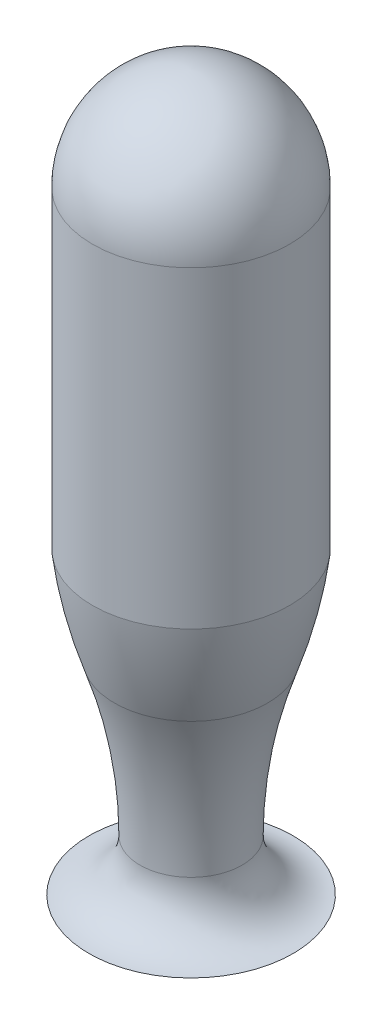
ISO-10303-21;
HEADER;
FILE_DESCRIPTION(('STEP AP214'),'2;1');
FILE_NAME('part.step','',(''),(''),'','','');
FILE_SCHEMA(('AUTOMOTIVE_DESIGN { 1 0 10303 214 1 1 1 1 }'));
ENDSEC;
DATA;
#1=APPLICATION_CONTEXT('core data for automotive mechanical design processes');
#2=APPLICATION_PROTOCOL_DEFINITION('international standard','automotive_design',2000,#1);
#3=PRODUCT_CONTEXT('',#1,'mechanical');
#4=PRODUCT('Part','Part','',(#3));
#5=PRODUCT_RELATED_PRODUCT_CATEGORY('part','',(#4));
#6=PRODUCT_DEFINITION_FORMATION('','',#4);
#7=PRODUCT_DEFINITION_CONTEXT('part definition',#1,'design');
#8=PRODUCT_DEFINITION('design','',#6,#7);
#9=PRODUCT_DEFINITION_SHAPE('','',#8);
#10=(LENGTH_UNIT() NAMED_UNIT(*) SI_UNIT(.MILLI.,.METRE.));
#11=(NAMED_UNIT(*) PLANE_ANGLE_UNIT() SI_UNIT($,.RADIAN.));
#12=(NAMED_UNIT(*) SI_UNIT($,.STERADIAN.) SOLID_ANGLE_UNIT());
#13=UNCERTAINTY_MEASURE_WITH_UNIT(LENGTH_MEASURE(1.E-05),#10,'distance_accuracy_value','');
#14=(GEOMETRIC_REPRESENTATION_CONTEXT(3) GLOBAL_UNCERTAINTY_ASSIGNED_CONTEXT((#13)) GLOBAL_UNIT_ASSIGNED_CONTEXT((#10,
#11,#12)) REPRESENTATION_CONTEXT('',''));
#15=CARTESIAN_POINT('',(0.,0.,0.));
#16=DIRECTION('',(0.,0.,1.));
#17=DIRECTION('',(1.,0.,0.));
#18=AXIS2_PLACEMENT_3D('',#15,#16,#17);
#19=CARTESIAN_POINT('',(0.,-5.81079378493446,0.));
#20=DIRECTION('',(0.,-1.,0.));
#21=DIRECTION('',(0.,0.,-1.));
#22=AXIS2_PLACEMENT_3D('',#19,#20,#21);
#23=PLANE('',#22);
#24=CARTESIAN_POINT('',(0.,-5.81079378493446,0.));
#25=DIRECTION('',(0.,-1.,0.));
#26=DIRECTION('',(0.,0.,-1.));
#27=AXIS2_PLACEMENT_3D('',#24,#25,#26);
#28=CIRCLE('',#27,1.5);
#29=CARTESIAN_POINT('',(0.,-5.81079378493446,-1.5));
#30=VERTEX_POINT('',#29);
#31=EDGE_CURVE('E66',#30,#30,#28,.T.);
#32=ORIENTED_EDGE('',*,*,#31,.F.);
#33=EDGE_LOOP('',(#32));
#34=FACE_BOUND('',#33,.T.);
#35=CARTESIAN_POINT('',(0.,-5.81079378493446,0.));
#36=DIRECTION('',(0.,-1.,0.));
#37=DIRECTION('',(0.,0.,-1.));
#38=AXIS2_PLACEMENT_3D('',#35,#36,#37);
#39=CIRCLE('',#38,4.);
#40=CARTESIAN_POINT('',(0.,-5.81079378493446,-4.));
#41=VERTEX_POINT('',#40);
#42=EDGE_CURVE('E62',#41,#41,#39,.T.);
#43=ORIENTED_EDGE('',*,*,#42,.T.);
#44=EDGE_LOOP('',(#43));
#45=FACE_BOUND('',#44,.T.);
#46=ADVANCED_FACE('F33',(#34,#45),#23,.T.);
#47=CARTESIAN_POINT('',(0.,18.1892062150655,0.138290187286729));
#48=DIRECTION('',(-1.,0.,0.));
#49=DIRECTION('',(0.,0.,-1.));
#50=AXIS2_PLACEMENT_3D('',#47,#48,#49);
#51=CIRCLE('',#50,4.);
#52=TRIMMED_CURVE('',#51,(PARAMETER_VALUE(-1.5362168890634)),(PARAMETER_VALUE(1.5362168890634)),
.T.,.PARAMETER.);
#53=CARTESIAN_POINT('',(0.,18.1892062150655,0.));
#54=DIRECTION('',(0.,-1.,0.));
#55=AXIS1_PLACEMENT('',#53,#54);
#56=SURFACE_OF_REVOLUTION('',#52,#55);
#57=CARTESIAN_POINT('',(0.,22.1868149783264,0.));
#58=VERTEX_POINT('',#57);
#59=VERTEX_LOOP('',#58);
#60=FACE_BOUND('',#59,.T.);
#61=CARTESIAN_POINT('',(0.,18.1892062150655,0.));
#62=DIRECTION('',(0.,-1.,0.));
#63=DIRECTION('',(0.,0.,-1.));
#64=AXIS2_PLACEMENT_3D('',#61,#62,#63);
#65=CIRCLE('',#64,3.86170981271327);
#66=CARTESIAN_POINT('',(0.,18.1892062150655,-3.86170981271327));
#67=VERTEX_POINT('',#66);
#68=EDGE_CURVE('E11',#67,#67,#65,.T.);
#69=ORIENTED_EDGE('',*,*,#68,.F.);
#70=EDGE_LOOP('',(#69));
#71=FACE_BOUND('',#70,.T.);
#72=ADVANCED_FACE('F42',(#60,#71),#56,.T.);
#73=CARTESIAN_POINT('',(0.,-5.81079378493446,0.));
#74=DIRECTION('',(0.,-1.,0.));
#75=DIRECTION('',(0.,0.,-1.));
#76=AXIS2_PLACEMENT_3D('',#73,#74,#75);
#77=CYLINDRICAL_SURFACE('',#76,3.86170981271327);
#78=ORIENTED_EDGE('',*,*,#68,.T.);
#79=EDGE_LOOP('',(#78));
#80=FACE_BOUND('',#79,.T.);
#81=CARTESIAN_POINT('',(0.,5.93141686401696,0.));
#82=DIRECTION('',(0.,-1.,0.));
#83=DIRECTION('',(0.,0.,-1.));
#84=AXIS2_PLACEMENT_3D('',#81,#82,#83);
#85=CIRCLE('',#84,3.86170981271327);
#86=CARTESIAN_POINT('',(0.,5.93141686401696,-3.86170981271327));
#87=VERTEX_POINT('',#86);
#88=EDGE_CURVE('E39',#87,#87,#85,.T.);
#89=ORIENTED_EDGE('',*,*,#88,.F.);
#90=EDGE_LOOP('',(#89));
#91=FACE_BOUND('',#90,.T.);
#92=ADVANCED_FACE('F45',(#80,#91),#77,.T.);
#93=CARTESIAN_POINT('',(0.,8.18920621506554,0.));
#94=DIRECTION('',(0.,-1.,0.));
#95=DIRECTION('',(0.,0.,-1.));
#96=AXIS2_PLACEMENT_3D('',#93,#94,#95);
#97=DEGENERATE_TOROIDAL_SURFACE('',#96,14.5,18.5,.F.);
#98=ORIENTED_EDGE('',*,*,#88,.T.);
#99=EDGE_LOOP('',(#98));
#100=FACE_BOUND('',#99,.T.);
#101=CARTESIAN_POINT('',(0.,2.18920621506554,0.));
#102=DIRECTION('',(0.,-1.,0.));
#103=DIRECTION('',(0.,0.,-1.));
#104=AXIS2_PLACEMENT_3D('',#101,#102,#103);
#105=CIRCLE('',#104,2.99999999999998);
#106=CARTESIAN_POINT('',(0.,2.18920621506554,-2.99999999999998));
#107=VERTEX_POINT('',#106);
#108=EDGE_CURVE('E55',#107,#107,#105,.T.);
#109=ORIENTED_EDGE('',*,*,#108,.F.);
#110=EDGE_LOOP('',(#109));
#111=FACE_BOUND('',#110,.T.);
#112=ADVANCED_FACE('F50',(#100,#111),#97,.F.);
#113=CARTESIAN_POINT('',(0.,-3.81079378493446,0.));
#114=DIRECTION('',(0.,-1.,0.));
#115=DIRECTION('',(0.,0.,-1.));
#116=AXIS2_PLACEMENT_3D('',#113,#114,#115);
#117=TOROIDAL_SURFACE('',#116,20.5,18.5);
#118=ORIENTED_EDGE('',*,*,#108,.T.);
#119=EDGE_LOOP('',(#118));
#120=FACE_BOUND('',#119,.T.);
#121=CARTESIAN_POINT('',(0.,-3.81079378493446,0.));
#122=DIRECTION('',(0.,-1.,0.));
#123=DIRECTION('',(0.,0.,-1.));
#124=AXIS2_PLACEMENT_3D('',#121,#122,#123);
#125=CIRCLE('',#124,1.99999999999999);
#126=CARTESIAN_POINT('',(0.,-3.81079378493446,-1.99999999999999));
#127=VERTEX_POINT('',#126);
#128=EDGE_CURVE('E57',#127,#127,#125,.T.);
#129=ORIENTED_EDGE('',*,*,#128,.F.);
#130=EDGE_LOOP('',(#129));
#131=FACE_BOUND('',#130,.T.);
#132=ADVANCED_FACE('F86',(#120,#131),#117,.F.);
#133=CARTESIAN_POINT('',(0.,-3.81079378493446,0.));
#134=DIRECTION('',(0.,-1.,0.));
#135=DIRECTION('',(0.,0.,-1.));
#136=AXIS2_PLACEMENT_3D('',#133,#134,#135);
#137=TOROIDAL_SURFACE('',#136,4.,2.);
#138=ORIENTED_EDGE('',*,*,#128,.T.);
#139=EDGE_LOOP('',(#138));
#140=FACE_BOUND('',#139,.T.);
#141=ORIENTED_EDGE('',*,*,#42,.F.);
#142=EDGE_LOOP('',(#141));
#143=FACE_BOUND('',#142,.T.);
#144=ADVANCED_FACE('F77',(#140,#143),#137,.F.);
#145=CARTESIAN_POINT('',(0.,4.18920621506554,0.));
#146=DIRECTION('',(0.,-1.,0.));
#147=DIRECTION('',(0.,0.,-1.));
#148=AXIS2_PLACEMENT_3D('',#145,#146,#147);
#149=CYLINDRICAL_SURFACE('',#148,1.5);
#150=CARTESIAN_POINT('',(0.,4.18920621506554,0.));
#151=DIRECTION('',(0.,-1.,0.));
#152=DIRECTION('',(0.,0.,-1.));
#153=AXIS2_PLACEMENT_3D('',#150,#151,#152);
#154=CIRCLE('',#153,1.5);
#155=CARTESIAN_POINT('',(0.,4.18920621506554,-1.5));
#156=VERTEX_POINT('',#155);
#157=EDGE_CURVE('E65',#156,#156,#154,.T.);
#158=ORIENTED_EDGE('',*,*,#157,.F.);
#159=EDGE_LOOP('',(#158));
#160=FACE_BOUND('',#159,.T.);
#161=ORIENTED_EDGE('',*,*,#31,.T.);
#162=EDGE_LOOP('',(#161));
#163=FACE_BOUND('',#162,.T.);
#164=ADVANCED_FACE('F74',(#160,#163),#149,.F.);
#165=CARTESIAN_POINT('',(0.,4.18920621506554,0.));
#166=DIRECTION('',(0.,-1.,0.));
#167=DIRECTION('',(0.,0.,-1.));
#168=AXIS2_PLACEMENT_3D('',#165,#166,#167);
#169=PLANE('',#168);
#170=ORIENTED_EDGE('',*,*,#157,.T.);
#171=EDGE_LOOP('',(#170));
#172=FACE_BOUND('',#171,.T.);
#173=ADVANCED_FACE('F72',(#172),#169,.T.);
#174=CLOSED_SHELL('',(#46,#72,#92,#112,#132,#144,#164,#173));
#175=MANIFOLD_SOLID_BREP('B2',#174);
#176=ADVANCED_BREP_SHAPE_REPRESENTATION('',(#18,#175),#14);
#177=SHAPE_DEFINITION_REPRESENTATION(#9,#176);
ENDSEC;
END-ISO-10303-21;
